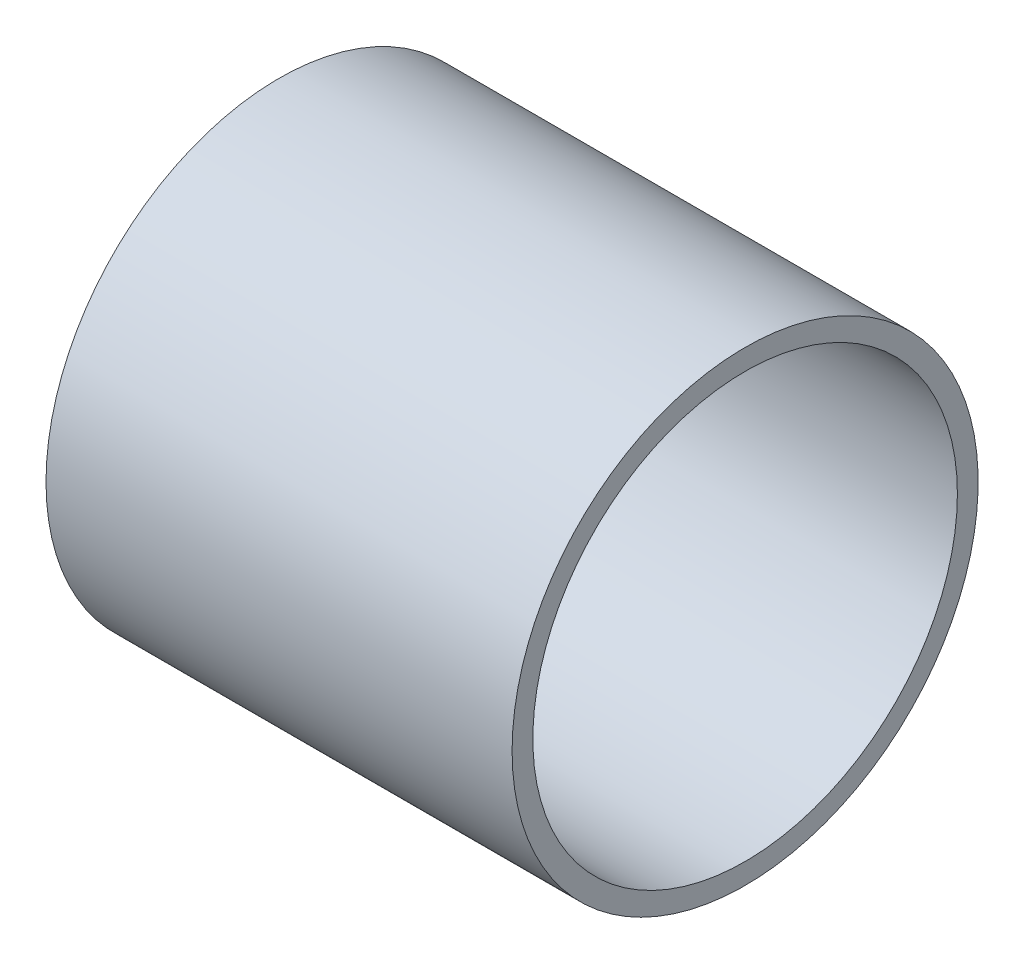
ISO-10303-21;
HEADER;
FILE_DESCRIPTION(('STEP AP214'),'2;1');
FILE_NAME('part.step','',(''),(''),'','','');
FILE_SCHEMA(('AUTOMOTIVE_DESIGN { 1 0 10303 214 1 1 1 1 }'));
ENDSEC;
DATA;
#1=APPLICATION_CONTEXT('core data for automotive mechanical design processes');
#2=APPLICATION_PROTOCOL_DEFINITION('international standard','automotive_design',2000,#1);
#3=PRODUCT_CONTEXT('',#1,'mechanical');
#4=PRODUCT('Part','Part','',(#3));
#5=PRODUCT_RELATED_PRODUCT_CATEGORY('part','',(#4));
#6=PRODUCT_DEFINITION_FORMATION('','',#4);
#7=PRODUCT_DEFINITION_CONTEXT('part definition',#1,'design');
#8=PRODUCT_DEFINITION('design','',#6,#7);
#9=PRODUCT_DEFINITION_SHAPE('','',#8);
#10=(LENGTH_UNIT() NAMED_UNIT(*) SI_UNIT(.MILLI.,.METRE.));
#11=(NAMED_UNIT(*) PLANE_ANGLE_UNIT() SI_UNIT($,.RADIAN.));
#12=(NAMED_UNIT(*) SI_UNIT($,.STERADIAN.) SOLID_ANGLE_UNIT());
#13=UNCERTAINTY_MEASURE_WITH_UNIT(LENGTH_MEASURE(1.E-05),#10,'distance_accuracy_value','');
#14=(GEOMETRIC_REPRESENTATION_CONTEXT(3) GLOBAL_UNCERTAINTY_ASSIGNED_CONTEXT((#13)) GLOBAL_UNIT_ASSIGNED_CONTEXT((#10,
#11,#12)) REPRESENTATION_CONTEXT('',''));
#15=CARTESIAN_POINT('',(0.,0.,0.));
#16=DIRECTION('',(0.,0.,1.));
#17=DIRECTION('',(1.,0.,0.));
#18=AXIS2_PLACEMENT_3D('',#15,#16,#17);
#19=CARTESIAN_POINT('',(5.5,2.75,0.));
#20=DIRECTION('',(-1.,0.,0.));
#21=DIRECTION('',(0.,0.,1.));
#22=AXIS2_PLACEMENT_3D('',#19,#20,#21);
#23=PLANE('',#22);
#24=CARTESIAN_POINT('',(5.5,-2.75,0.));
#25=DIRECTION('',(1.,0.,0.));
#26=DIRECTION('',(0.,0.,-1.));
#27=AXIS2_PLACEMENT_3D('',#24,#25,#26);
#28=CIRCLE('',#27,5.01);
#29=CARTESIAN_POINT('',(5.5,-2.75,-5.01));
#30=VERTEX_POINT('',#29);
#31=EDGE_CURVE('E58',#30,#30,#28,.T.);
#32=ORIENTED_EDGE('',*,*,#31,.F.);
#33=EDGE_LOOP('',(#32));
#34=FACE_BOUND('',#33,.T.);
#35=CARTESIAN_POINT('',(5.5,-2.75,0.));
#36=DIRECTION('',(-1.,0.,0.));
#37=DIRECTION('',(0.,0.,1.));
#38=AXIS2_PLACEMENT_3D('',#35,#36,#37);
#39=CIRCLE('',#38,5.5);
#40=CARTESIAN_POINT('',(5.5,-2.75,5.5));
#41=VERTEX_POINT('',#40);
#42=EDGE_CURVE('E10',#41,#41,#39,.T.);
#43=ORIENTED_EDGE('',*,*,#42,.F.);
#44=EDGE_LOOP('',(#43));
#45=FACE_BOUND('',#44,.T.);
#46=ADVANCED_FACE('F41',(#34,#45),#23,.F.);
#47=CARTESIAN_POINT('',(-5.5,-2.75,0.));
#48=DIRECTION('',(-1.,0.,0.));
#49=DIRECTION('',(0.,0.,1.));
#50=AXIS2_PLACEMENT_3D('',#47,#48,#49);
#51=CYLINDRICAL_SURFACE('',#50,5.5);
#52=CARTESIAN_POINT('',(-5.5,-2.75,0.));
#53=DIRECTION('',(-1.,0.,0.));
#54=DIRECTION('',(0.,0.,1.));
#55=AXIS2_PLACEMENT_3D('',#52,#53,#54);
#56=CIRCLE('',#55,5.5);
#57=CARTESIAN_POINT('',(-5.5,-2.75,5.5));
#58=VERTEX_POINT('',#57);
#59=EDGE_CURVE('E48',#58,#58,#56,.T.);
#60=ORIENTED_EDGE('',*,*,#59,.F.);
#61=EDGE_LOOP('',(#60));
#62=FACE_BOUND('',#61,.T.);
#63=ORIENTED_EDGE('',*,*,#42,.T.);
#64=EDGE_LOOP('',(#63));
#65=FACE_BOUND('',#64,.T.);
#66=ADVANCED_FACE('F69',(#62,#65),#51,.T.);
#67=CARTESIAN_POINT('',(-5.5,2.75,0.));
#68=DIRECTION('',(1.,0.,0.));
#69=DIRECTION('',(0.,0.,-1.));
#70=AXIS2_PLACEMENT_3D('',#67,#68,#69);
#71=PLANE('',#70);
#72=CARTESIAN_POINT('',(-5.5,-2.75,0.));
#73=DIRECTION('',(1.,0.,0.));
#74=DIRECTION('',(0.,0.,-1.));
#75=AXIS2_PLACEMENT_3D('',#72,#73,#74);
#76=CIRCLE('',#75,5.01);
#77=CARTESIAN_POINT('',(-5.5,-2.75,-5.01));
#78=VERTEX_POINT('',#77);
#79=EDGE_CURVE('E53',#78,#78,#76,.T.);
#80=ORIENTED_EDGE('',*,*,#79,.T.);
#81=EDGE_LOOP('',(#80));
#82=FACE_BOUND('',#81,.T.);
#83=ORIENTED_EDGE('',*,*,#59,.T.);
#84=EDGE_LOOP('',(#83));
#85=FACE_BOUND('',#84,.T.);
#86=ADVANCED_FACE('F73',(#82,#85),#71,.F.);
#87=CARTESIAN_POINT('',(-5.5,-2.75,0.));
#88=DIRECTION('',(1.,0.,0.));
#89=DIRECTION('',(0.,0.,-1.));
#90=AXIS2_PLACEMENT_3D('',#87,#88,#89);
#91=CYLINDRICAL_SURFACE('',#90,5.01);
#92=ORIENTED_EDGE('',*,*,#79,.F.);
#93=EDGE_LOOP('',(#92));
#94=FACE_BOUND('',#93,.T.);
#95=ORIENTED_EDGE('',*,*,#31,.T.);
#96=EDGE_LOOP('',(#95));
#97=FACE_BOUND('',#96,.T.);
#98=ADVANCED_FACE('F65',(#94,#97),#91,.F.);
#99=CLOSED_SHELL('',(#46,#66,#86,#98));
#100=MANIFOLD_SOLID_BREP('B2',#99);
#101=ADVANCED_BREP_SHAPE_REPRESENTATION('',(#18,#100),#14);
#102=SHAPE_DEFINITION_REPRESENTATION(#9,#101);
ENDSEC;
END-ISO-10303-21;
